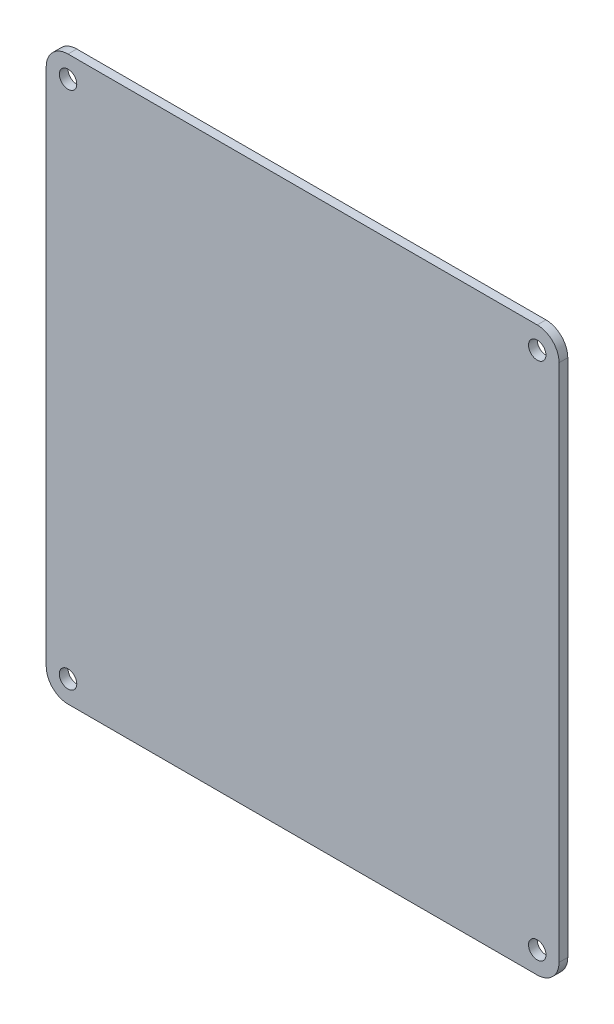
ISO-10303-21;
HEADER;
FILE_DESCRIPTION(('STEP AP214'),'2;1');
FILE_NAME('part.step','',(''),(''),'','','');
FILE_SCHEMA(('AUTOMOTIVE_DESIGN { 1 0 10303 214 1 1 1 1 }'));
ENDSEC;
DATA;
#1=APPLICATION_CONTEXT('core data for automotive mechanical design processes');
#2=APPLICATION_PROTOCOL_DEFINITION('international standard','automotive_design',2000,#1);
#3=PRODUCT_CONTEXT('',#1,'mechanical');
#4=PRODUCT('Part','Part','',(#3));
#5=PRODUCT_RELATED_PRODUCT_CATEGORY('part','',(#4));
#6=PRODUCT_DEFINITION_FORMATION('','',#4);
#7=PRODUCT_DEFINITION_CONTEXT('part definition',#1,'design');
#8=PRODUCT_DEFINITION('design','',#6,#7);
#9=PRODUCT_DEFINITION_SHAPE('','',#8);
#10=(LENGTH_UNIT() NAMED_UNIT(*) SI_UNIT(.MILLI.,.METRE.));
#11=(NAMED_UNIT(*) PLANE_ANGLE_UNIT() SI_UNIT($,.RADIAN.));
#12=(NAMED_UNIT(*) SI_UNIT($,.STERADIAN.) SOLID_ANGLE_UNIT());
#13=UNCERTAINTY_MEASURE_WITH_UNIT(LENGTH_MEASURE(1.E-05),#10,'distance_accuracy_value','');
#14=(GEOMETRIC_REPRESENTATION_CONTEXT(3) GLOBAL_UNCERTAINTY_ASSIGNED_CONTEXT((#13)) GLOBAL_UNIT_ASSIGNED_CONTEXT((#10,
#11,#12)) REPRESENTATION_CONTEXT('',''));
#15=CARTESIAN_POINT('',(0.,0.,0.));
#16=DIRECTION('',(0.,0.,1.));
#17=DIRECTION('',(1.,0.,0.));
#18=AXIS2_PLACEMENT_3D('',#15,#16,#17);
#19=CARTESIAN_POINT('',(69.0000000000002,-166.5,2.));
#20=DIRECTION('',(0.,0.,1.));
#21=DIRECTION('',(1.,0.,0.));
#22=AXIS2_PLACEMENT_3D('',#19,#20,#21);
#23=PLANE('',#22);
#24=CARTESIAN_POINT('',(69.0000000000002,-166.5,2.));
#25=DIRECTION('',(0.,0.,1.));
#26=DIRECTION('',(1.,0.,0.));
#27=AXIS2_PLACEMENT_3D('',#24,#25,#26);
#28=CIRCLE('',#27,2.);
#29=CARTESIAN_POINT('',(71.0000000000002,-166.5,2.));
#30=VERTEX_POINT('',#29);
#31=EDGE_CURVE('E199',#30,#30,#28,.T.);
#32=ORIENTED_EDGE('',*,*,#31,.F.);
#33=EDGE_LOOP('',(#32));
#34=FACE_BOUND('',#33,.T.);
#35=CARTESIAN_POINT('',(69.0000000000002,-47.5,2.));
#36=DIRECTION('',(0.,0.,1.));
#37=DIRECTION('',(1.,0.,0.));
#38=AXIS2_PLACEMENT_3D('',#35,#36,#37);
#39=CIRCLE('',#38,2.);
#40=CARTESIAN_POINT('',(71.0000000000002,-47.5,2.));
#41=VERTEX_POINT('',#40);
#42=EDGE_CURVE('E141',#41,#41,#39,.T.);
#43=ORIENTED_EDGE('',*,*,#42,.F.);
#44=EDGE_LOOP('',(#43));
#45=FACE_BOUND('',#44,.T.);
#46=CARTESIAN_POINT('',(69.0000000000002,-166.5,2.));
#47=DIRECTION('',(0.,0.,1.));
#48=DIRECTION('',(1.,0.,0.));
#49=AXIS2_PLACEMENT_3D('',#46,#47,#48);
#50=CIRCLE('',#49,5.);
#51=CARTESIAN_POINT('',(64.0000000000002,-166.5,2.));
#52=VERTEX_POINT('',#51);
#53=CARTESIAN_POINT('',(69.0000000000002,-171.5,2.));
#54=VERTEX_POINT('',#53);
#55=EDGE_CURVE('E154',#52,#54,#50,.T.);
#56=ORIENTED_EDGE('',*,*,#55,.T.);
#57=DIRECTION('',(1.,0.,0.));
#58=VECTOR('',#57,1.);
#59=CARTESIAN_POINT('',(69.0000000000002,-171.5,2.));
#60=LINE('',#59,#58);
#61=CARTESIAN_POINT('',(176.500000000009,-171.5,2.));
#62=VERTEX_POINT('',#61);
#63=EDGE_CURVE('E94',#54,#62,#60,.T.);
#64=ORIENTED_EDGE('',*,*,#63,.T.);
#65=CARTESIAN_POINT('',(176.500000000009,-166.5,2.));
#66=DIRECTION('',(0.,0.,1.));
#67=DIRECTION('',(1.,0.,0.));
#68=AXIS2_PLACEMENT_3D('',#65,#66,#67);
#69=CIRCLE('',#68,5.);
#70=CARTESIAN_POINT('',(181.500000000009,-166.5,2.));
#71=VERTEX_POINT('',#70);
#72=EDGE_CURVE('E169',#62,#71,#69,.T.);
#73=ORIENTED_EDGE('',*,*,#72,.T.);
#74=DIRECTION('',(0.,1.,0.));
#75=VECTOR('',#74,1.);
#76=CARTESIAN_POINT('',(181.500000000009,-47.5,2.));
#77=LINE('',#76,#75);
#78=CARTESIAN_POINT('',(181.500000000009,-47.5,2.));
#79=VERTEX_POINT('',#78);
#80=EDGE_CURVE('E182',#71,#79,#77,.T.);
#81=ORIENTED_EDGE('',*,*,#80,.T.);
#82=CARTESIAN_POINT('',(176.500000000009,-47.5,2.));
#83=DIRECTION('',(0.,0.,1.));
#84=DIRECTION('',(-1.,0.,0.));
#85=AXIS2_PLACEMENT_3D('',#82,#83,#84);
#86=CIRCLE('',#85,5.);
#87=CARTESIAN_POINT('',(176.500000000009,-42.5,2.));
#88=VERTEX_POINT('',#87);
#89=EDGE_CURVE('E113',#79,#88,#86,.T.);
#90=ORIENTED_EDGE('',*,*,#89,.T.);
#91=DIRECTION('',(-1.,0.,0.));
#92=VECTOR('',#91,1.);
#93=CARTESIAN_POINT('',(69.0000000000002,-42.5,2.));
#94=LINE('',#93,#92);
#95=CARTESIAN_POINT('',(69.0000000000002,-42.5,2.));
#96=VERTEX_POINT('',#95);
#97=EDGE_CURVE('E107',#88,#96,#94,.T.);
#98=ORIENTED_EDGE('',*,*,#97,.T.);
#99=CARTESIAN_POINT('',(69.0000000000002,-47.5,2.));
#100=DIRECTION('',(0.,0.,1.));
#101=DIRECTION('',(1.,0.,0.));
#102=AXIS2_PLACEMENT_3D('',#99,#100,#101);
#103=CIRCLE('',#102,5.);
#104=CARTESIAN_POINT('',(64.0000000000002,-47.5,2.));
#105=VERTEX_POINT('',#104);
#106=EDGE_CURVE('E111',#96,#105,#103,.T.);
#107=ORIENTED_EDGE('',*,*,#106,.T.);
#108=DIRECTION('',(0.,-1.,0.));
#109=VECTOR('',#108,1.);
#110=CARTESIAN_POINT('',(64.0000000000002,-47.5,2.));
#111=LINE('',#110,#109);
#112=EDGE_CURVE('E51',#105,#52,#111,.T.);
#113=ORIENTED_EDGE('',*,*,#112,.T.);
#114=EDGE_LOOP('',(#56,#64,#73,#81,#90,#98,#107,#113));
#115=FACE_BOUND('',#114,.T.);
#116=CARTESIAN_POINT('',(176.500000000009,-47.5,2.));
#117=DIRECTION('',(0.,0.,1.));
#118=DIRECTION('',(1.,0.,0.));
#119=AXIS2_PLACEMENT_3D('',#116,#117,#118);
#120=CIRCLE('',#119,2.);
#121=CARTESIAN_POINT('',(178.500000000009,-47.5,2.));
#122=VERTEX_POINT('',#121);
#123=EDGE_CURVE('E192',#122,#122,#120,.T.);
#124=ORIENTED_EDGE('',*,*,#123,.F.);
#125=EDGE_LOOP('',(#124));
#126=FACE_BOUND('',#125,.T.);
#127=CARTESIAN_POINT('',(176.500000000009,-166.5,2.));
#128=DIRECTION('',(0.,0.,1.));
#129=DIRECTION('',(1.,0.,0.));
#130=AXIS2_PLACEMENT_3D('',#127,#128,#129);
#131=CIRCLE('',#130,2.);
#132=CARTESIAN_POINT('',(178.500000000009,-166.5,2.));
#133=VERTEX_POINT('',#132);
#134=EDGE_CURVE('E206',#133,#133,#131,.T.);
#135=ORIENTED_EDGE('',*,*,#134,.F.);
#136=EDGE_LOOP('',(#135));
#137=FACE_BOUND('',#136,.T.);
#138=ADVANCED_FACE('F34',(#34,#45,#115,#126,#137),#23,.T.);
#139=CARTESIAN_POINT('',(69.0000000000002,-166.5,0.));
#140=DIRECTION('',(0.,0.,1.));
#141=DIRECTION('',(1.,0.,0.));
#142=AXIS2_PLACEMENT_3D('',#139,#140,#141);
#143=PLANE('',#142);
#144=CARTESIAN_POINT('',(69.0000000000002,-166.5,0.));
#145=DIRECTION('',(0.,0.,1.));
#146=DIRECTION('',(1.,0.,0.));
#147=AXIS2_PLACEMENT_3D('',#144,#145,#146);
#148=CIRCLE('',#147,5.);
#149=CARTESIAN_POINT('',(64.0000000000002,-166.5,0.));
#150=VERTEX_POINT('',#149);
#151=CARTESIAN_POINT('',(69.0000000000002,-171.5,0.));
#152=VERTEX_POINT('',#151);
#153=EDGE_CURVE('E137',#150,#152,#148,.T.);
#154=ORIENTED_EDGE('',*,*,#153,.F.);
#155=DIRECTION('',(0.,-1.,0.));
#156=VECTOR('',#155,1.);
#157=CARTESIAN_POINT('',(64.0000000000002,-47.5,0.));
#158=LINE('',#157,#156);
#159=CARTESIAN_POINT('',(64.0000000000002,-47.5,0.));
#160=VERTEX_POINT('',#159);
#161=EDGE_CURVE('E86',#160,#150,#158,.T.);
#162=ORIENTED_EDGE('',*,*,#161,.F.);
#163=CARTESIAN_POINT('',(69.0000000000002,-47.5,0.));
#164=DIRECTION('',(0.,0.,1.));
#165=DIRECTION('',(1.,0.,0.));
#166=AXIS2_PLACEMENT_3D('',#163,#164,#165);
#167=CIRCLE('',#166,5.);
#168=CARTESIAN_POINT('',(69.0000000000002,-42.5,0.));
#169=VERTEX_POINT('',#168);
#170=EDGE_CURVE('E80',#169,#160,#167,.T.);
#171=ORIENTED_EDGE('',*,*,#170,.F.);
#172=DIRECTION('',(-1.,0.,0.));
#173=VECTOR('',#172,1.);
#174=CARTESIAN_POINT('',(69.0000000000002,-42.5,0.));
#175=LINE('',#174,#173);
#176=CARTESIAN_POINT('',(176.500000000009,-42.5,0.));
#177=VERTEX_POINT('',#176);
#178=EDGE_CURVE('E122',#177,#169,#175,.T.);
#179=ORIENTED_EDGE('',*,*,#178,.F.);
#180=CARTESIAN_POINT('',(176.500000000009,-47.5,0.));
#181=DIRECTION('',(0.,0.,1.));
#182=DIRECTION('',(-1.,0.,0.));
#183=AXIS2_PLACEMENT_3D('',#180,#181,#182);
#184=CIRCLE('',#183,5.);
#185=CARTESIAN_POINT('',(181.500000000009,-47.5,0.));
#186=VERTEX_POINT('',#185);
#187=EDGE_CURVE('E147',#186,#177,#184,.T.);
#188=ORIENTED_EDGE('',*,*,#187,.F.);
#189=DIRECTION('',(0.,1.,0.));
#190=VECTOR('',#189,1.);
#191=CARTESIAN_POINT('',(181.500000000009,-47.5,0.));
#192=LINE('',#191,#190);
#193=CARTESIAN_POINT('',(181.500000000009,-166.5,0.));
#194=VERTEX_POINT('',#193);
#195=EDGE_CURVE('E145',#194,#186,#192,.T.);
#196=ORIENTED_EDGE('',*,*,#195,.F.);
#197=CARTESIAN_POINT('',(176.500000000009,-166.5,0.));
#198=DIRECTION('',(0.,0.,1.));
#199=DIRECTION('',(1.,0.,0.));
#200=AXIS2_PLACEMENT_3D('',#197,#198,#199);
#201=CIRCLE('',#200,5.);
#202=CARTESIAN_POINT('',(176.500000000009,-171.5,0.));
#203=VERTEX_POINT('',#202);
#204=EDGE_CURVE('E143',#203,#194,#201,.T.);
#205=ORIENTED_EDGE('',*,*,#204,.F.);
#206=DIRECTION('',(1.,0.,0.));
#207=VECTOR('',#206,1.);
#208=CARTESIAN_POINT('',(69.0000000000002,-171.5,0.));
#209=LINE('',#208,#207);
#210=EDGE_CURVE('E140',#152,#203,#209,.T.);
#211=ORIENTED_EDGE('',*,*,#210,.F.);
#212=EDGE_LOOP('',(#154,#162,#171,#179,#188,#196,#205,#211));
#213=FACE_BOUND('',#212,.T.);
#214=CARTESIAN_POINT('',(69.0000000000002,-47.5,0.));
#215=DIRECTION('',(0.,0.,1.));
#216=DIRECTION('',(1.,0.,0.));
#217=AXIS2_PLACEMENT_3D('',#214,#215,#216);
#218=CIRCLE('',#217,2.);
#219=CARTESIAN_POINT('',(71.0000000000002,-47.5,0.));
#220=VERTEX_POINT('',#219);
#221=EDGE_CURVE('E189',#220,#220,#218,.T.);
#222=ORIENTED_EDGE('',*,*,#221,.T.);
#223=EDGE_LOOP('',(#222));
#224=FACE_BOUND('',#223,.T.);
#225=CARTESIAN_POINT('',(176.500000000009,-47.5,0.));
#226=DIRECTION('',(0.,0.,1.));
#227=DIRECTION('',(1.,0.,0.));
#228=AXIS2_PLACEMENT_3D('',#225,#226,#227);
#229=CIRCLE('',#228,2.);
#230=CARTESIAN_POINT('',(178.500000000009,-47.5,0.));
#231=VERTEX_POINT('',#230);
#232=EDGE_CURVE('E196',#231,#231,#229,.T.);
#233=ORIENTED_EDGE('',*,*,#232,.T.);
#234=EDGE_LOOP('',(#233));
#235=FACE_BOUND('',#234,.T.);
#236=CARTESIAN_POINT('',(69.0000000000002,-166.5,0.));
#237=DIRECTION('',(0.,0.,1.));
#238=DIRECTION('',(1.,0.,0.));
#239=AXIS2_PLACEMENT_3D('',#236,#237,#238);
#240=CIRCLE('',#239,2.);
#241=CARTESIAN_POINT('',(71.0000000000002,-166.5,0.));
#242=VERTEX_POINT('',#241);
#243=EDGE_CURVE('E203',#242,#242,#240,.T.);
#244=ORIENTED_EDGE('',*,*,#243,.T.);
#245=EDGE_LOOP('',(#244));
#246=FACE_BOUND('',#245,.T.);
#247=CARTESIAN_POINT('',(176.500000000009,-166.5,0.));
#248=DIRECTION('',(0.,0.,1.));
#249=DIRECTION('',(1.,0.,0.));
#250=AXIS2_PLACEMENT_3D('',#247,#248,#249);
#251=CIRCLE('',#250,2.);
#252=CARTESIAN_POINT('',(178.500000000009,-166.5,0.));
#253=VERTEX_POINT('',#252);
#254=EDGE_CURVE('E210',#253,#253,#251,.T.);
#255=ORIENTED_EDGE('',*,*,#254,.T.);
#256=EDGE_LOOP('',(#255));
#257=FACE_BOUND('',#256,.T.);
#258=ADVANCED_FACE('F173',(#213,#224,#235,#246,#257),#143,.F.);
#259=CARTESIAN_POINT('',(69.0000000000002,-166.5,2.));
#260=DIRECTION('',(0.,0.,-1.));
#261=DIRECTION('',(-1.,0.,0.));
#262=AXIS2_PLACEMENT_3D('',#259,#260,#261);
#263=CYLINDRICAL_SURFACE('',#262,5.);
#264=ORIENTED_EDGE('',*,*,#153,.T.);
#265=DIRECTION('',(0.,0.,-1.));
#266=VECTOR('',#265,1.);
#267=CARTESIAN_POINT('',(69.0000000000002,-171.5,2.));
#268=LINE('',#267,#266);
#269=EDGE_CURVE('E11',#54,#152,#268,.T.);
#270=ORIENTED_EDGE('',*,*,#269,.F.);
#271=ORIENTED_EDGE('',*,*,#55,.F.);
#272=DIRECTION('',(0.,0.,-1.));
#273=VECTOR('',#272,1.);
#274=CARTESIAN_POINT('',(64.0000000000002,-166.5,2.));
#275=LINE('',#274,#273);
#276=EDGE_CURVE('E133',#52,#150,#275,.T.);
#277=ORIENTED_EDGE('',*,*,#276,.T.);
#278=EDGE_LOOP('',(#264,#270,#271,#277));
#279=FACE_BOUND('',#278,.T.);
#280=ADVANCED_FACE('F36',(#279),#263,.T.);
#281=CARTESIAN_POINT('',(69.0000000000002,-171.5,2.));
#282=DIRECTION('',(0.,1.,0.));
#283=DIRECTION('',(0.,0.,1.));
#284=AXIS2_PLACEMENT_3D('',#281,#282,#283);
#285=PLANE('',#284);
#286=ORIENTED_EDGE('',*,*,#210,.T.);
#287=DIRECTION('',(0.,0.,-1.));
#288=VECTOR('',#287,1.);
#289=CARTESIAN_POINT('',(176.500000000009,-171.5,2.));
#290=LINE('',#289,#288);
#291=EDGE_CURVE('E43',#62,#203,#290,.T.);
#292=ORIENTED_EDGE('',*,*,#291,.F.);
#293=ORIENTED_EDGE('',*,*,#63,.F.);
#294=ORIENTED_EDGE('',*,*,#269,.T.);
#295=EDGE_LOOP('',(#286,#292,#293,#294));
#296=FACE_BOUND('',#295,.T.);
#297=ADVANCED_FACE('F246',(#296),#285,.F.);
#298=CARTESIAN_POINT('',(176.500000000009,-166.5,2.));
#299=DIRECTION('',(0.,0.,-1.));
#300=DIRECTION('',(-1.,0.,0.));
#301=AXIS2_PLACEMENT_3D('',#298,#299,#300);
#302=CYLINDRICAL_SURFACE('',#301,5.);
#303=ORIENTED_EDGE('',*,*,#204,.T.);
#304=DIRECTION('',(0.,0.,-1.));
#305=VECTOR('',#304,1.);
#306=CARTESIAN_POINT('',(181.500000000009,-166.5,2.));
#307=LINE('',#306,#305);
#308=EDGE_CURVE('E161',#71,#194,#307,.T.);
#309=ORIENTED_EDGE('',*,*,#308,.F.);
#310=ORIENTED_EDGE('',*,*,#72,.F.);
#311=ORIENTED_EDGE('',*,*,#291,.T.);
#312=EDGE_LOOP('',(#303,#309,#310,#311));
#313=FACE_BOUND('',#312,.T.);
#314=ADVANCED_FACE('F167',(#313),#302,.T.);
#315=CARTESIAN_POINT('',(181.500000000009,-47.5,2.));
#316=DIRECTION('',(-1.,0.,0.));
#317=DIRECTION('',(0.,0.,1.));
#318=AXIS2_PLACEMENT_3D('',#315,#316,#317);
#319=PLANE('',#318);
#320=ORIENTED_EDGE('',*,*,#195,.T.);
#321=DIRECTION('',(0.,0.,-1.));
#322=VECTOR('',#321,1.);
#323=CARTESIAN_POINT('',(181.500000000009,-47.5,2.));
#324=LINE('',#323,#322);
#325=EDGE_CURVE('E158',#79,#186,#324,.T.);
#326=ORIENTED_EDGE('',*,*,#325,.F.);
#327=ORIENTED_EDGE('',*,*,#80,.F.);
#328=ORIENTED_EDGE('',*,*,#308,.T.);
#329=EDGE_LOOP('',(#320,#326,#327,#328));
#330=FACE_BOUND('',#329,.T.);
#331=ADVANCED_FACE('F178',(#330),#319,.F.);
#332=CARTESIAN_POINT('',(176.500000000009,-47.5,2.));
#333=DIRECTION('',(0.,0.,-1.));
#334=DIRECTION('',(-1.,0.,0.));
#335=AXIS2_PLACEMENT_3D('',#332,#333,#334);
#336=CYLINDRICAL_SURFACE('',#335,5.);
#337=ORIENTED_EDGE('',*,*,#187,.T.);
#338=DIRECTION('',(0.,0.,-1.));
#339=VECTOR('',#338,1.);
#340=CARTESIAN_POINT('',(176.500000000009,-42.5,2.));
#341=LINE('',#340,#339);
#342=EDGE_CURVE('E123',#88,#177,#341,.T.);
#343=ORIENTED_EDGE('',*,*,#342,.F.);
#344=ORIENTED_EDGE('',*,*,#89,.F.);
#345=ORIENTED_EDGE('',*,*,#325,.T.);
#346=EDGE_LOOP('',(#337,#343,#344,#345));
#347=FACE_BOUND('',#346,.T.);
#348=ADVANCED_FACE('F181',(#347),#336,.T.);
#349=CARTESIAN_POINT('',(69.0000000000002,-42.5,2.));
#350=DIRECTION('',(0.,-1.,0.));
#351=DIRECTION('',(0.,0.,-1.));
#352=AXIS2_PLACEMENT_3D('',#349,#350,#351);
#353=PLANE('',#352);
#354=ORIENTED_EDGE('',*,*,#178,.T.);
#355=DIRECTION('',(0.,0.,-1.));
#356=VECTOR('',#355,1.);
#357=CARTESIAN_POINT('',(69.0000000000002,-42.5,2.));
#358=LINE('',#357,#356);
#359=EDGE_CURVE('E119',#96,#169,#358,.T.);
#360=ORIENTED_EDGE('',*,*,#359,.F.);
#361=ORIENTED_EDGE('',*,*,#97,.F.);
#362=ORIENTED_EDGE('',*,*,#342,.T.);
#363=EDGE_LOOP('',(#354,#360,#361,#362));
#364=FACE_BOUND('',#363,.T.);
#365=ADVANCED_FACE('F120',(#364),#353,.F.);
#366=CARTESIAN_POINT('',(69.0000000000002,-47.5,2.));
#367=DIRECTION('',(0.,0.,-1.));
#368=DIRECTION('',(-1.,0.,0.));
#369=AXIS2_PLACEMENT_3D('',#366,#367,#368);
#370=CYLINDRICAL_SURFACE('',#369,5.);
#371=ORIENTED_EDGE('',*,*,#170,.T.);
#372=DIRECTION('',(0.,0.,-1.));
#373=VECTOR('',#372,1.);
#374=CARTESIAN_POINT('',(64.0000000000002,-47.5,2.));
#375=LINE('',#374,#373);
#376=EDGE_CURVE('E124',#105,#160,#375,.T.);
#377=ORIENTED_EDGE('',*,*,#376,.F.);
#378=ORIENTED_EDGE('',*,*,#106,.F.);
#379=ORIENTED_EDGE('',*,*,#359,.T.);
#380=EDGE_LOOP('',(#371,#377,#378,#379));
#381=FACE_BOUND('',#380,.T.);
#382=ADVANCED_FACE('F126',(#381),#370,.T.);
#383=CARTESIAN_POINT('',(64.0000000000002,-47.5,2.));
#384=DIRECTION('',(1.,0.,0.));
#385=DIRECTION('',(0.,1.,0.));
#386=AXIS2_PLACEMENT_3D('',#383,#384,#385);
#387=PLANE('',#386);
#388=ORIENTED_EDGE('',*,*,#161,.T.);
#389=ORIENTED_EDGE('',*,*,#276,.F.);
#390=ORIENTED_EDGE('',*,*,#112,.F.);
#391=ORIENTED_EDGE('',*,*,#376,.T.);
#392=EDGE_LOOP('',(#388,#389,#390,#391));
#393=FACE_BOUND('',#392,.T.);
#394=ADVANCED_FACE('F234',(#393),#387,.F.);
#395=CARTESIAN_POINT('',(69.0000000000002,-47.5,2.));
#396=DIRECTION('',(0.,0.,-1.));
#397=DIRECTION('',(-1.,0.,0.));
#398=AXIS2_PLACEMENT_3D('',#395,#396,#397);
#399=CYLINDRICAL_SURFACE('',#398,2.);
#400=ORIENTED_EDGE('',*,*,#42,.T.);
#401=EDGE_LOOP('',(#400));
#402=FACE_BOUND('',#401,.T.);
#403=ORIENTED_EDGE('',*,*,#221,.F.);
#404=EDGE_LOOP('',(#403));
#405=FACE_BOUND('',#404,.T.);
#406=ADVANCED_FACE('F231',(#402,#405),#399,.F.);
#407=CARTESIAN_POINT('',(176.500000000009,-47.5,2.));
#408=DIRECTION('',(0.,0.,-1.));
#409=DIRECTION('',(-1.,0.,0.));
#410=AXIS2_PLACEMENT_3D('',#407,#408,#409);
#411=CYLINDRICAL_SURFACE('',#410,2.);
#412=ORIENTED_EDGE('',*,*,#123,.T.);
#413=EDGE_LOOP('',(#412));
#414=FACE_BOUND('',#413,.T.);
#415=ORIENTED_EDGE('',*,*,#232,.F.);
#416=EDGE_LOOP('',(#415));
#417=FACE_BOUND('',#416,.T.);
#418=ADVANCED_FACE('F320',(#414,#417),#411,.F.);
#419=CARTESIAN_POINT('',(69.0000000000002,-166.5,2.));
#420=DIRECTION('',(0.,0.,-1.));
#421=DIRECTION('',(-1.,0.,0.));
#422=AXIS2_PLACEMENT_3D('',#419,#420,#421);
#423=CYLINDRICAL_SURFACE('',#422,2.);
#424=ORIENTED_EDGE('',*,*,#31,.T.);
#425=EDGE_LOOP('',(#424));
#426=FACE_BOUND('',#425,.T.);
#427=ORIENTED_EDGE('',*,*,#243,.F.);
#428=EDGE_LOOP('',(#427));
#429=FACE_BOUND('',#428,.T.);
#430=ADVANCED_FACE('F328',(#426,#429),#423,.F.);
#431=CARTESIAN_POINT('',(176.500000000009,-166.5,2.));
#432=DIRECTION('',(0.,0.,-1.));
#433=DIRECTION('',(-1.,0.,0.));
#434=AXIS2_PLACEMENT_3D('',#431,#432,#433);
#435=CYLINDRICAL_SURFACE('',#434,2.);
#436=ORIENTED_EDGE('',*,*,#134,.T.);
#437=EDGE_LOOP('',(#436));
#438=FACE_BOUND('',#437,.T.);
#439=ORIENTED_EDGE('',*,*,#254,.F.);
#440=EDGE_LOOP('',(#439));
#441=FACE_BOUND('',#440,.T.);
#442=ADVANCED_FACE('F218',(#438,#441),#435,.F.);
#443=CLOSED_SHELL('',(#138,#258,#280,#297,#314,#331,#348,#365,#382,#394,#406,#418,#430,#442));
#444=MANIFOLD_SOLID_BREP('B2',#443);
#445=ADVANCED_BREP_SHAPE_REPRESENTATION('',(#18,#444),#14);
#446=SHAPE_DEFINITION_REPRESENTATION(#9,#445);
ENDSEC;
END-ISO-10303-21;
